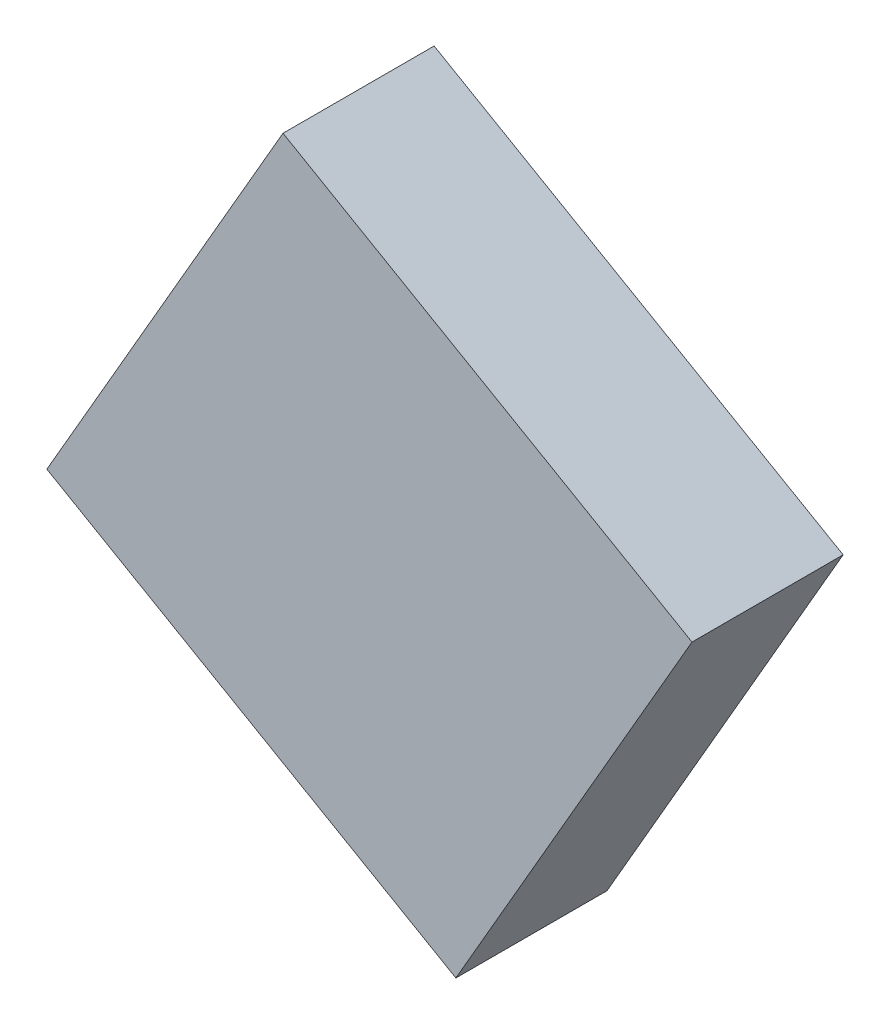
ISO-10303-21;
HEADER;
FILE_DESCRIPTION(('STEP AP214'),'2;1');
FILE_NAME('part.step','',(''),(''),'','','');
FILE_SCHEMA(('AUTOMOTIVE_DESIGN { 1 0 10303 214 1 1 1 1 }'));
ENDSEC;
DATA;
#1=APPLICATION_CONTEXT('core data for automotive mechanical design processes');
#2=APPLICATION_PROTOCOL_DEFINITION('international standard','automotive_design',2000,#1);
#3=PRODUCT_CONTEXT('',#1,'mechanical');
#4=PRODUCT('Part','Part','',(#3));
#5=PRODUCT_RELATED_PRODUCT_CATEGORY('part','',(#4));
#6=PRODUCT_DEFINITION_FORMATION('','',#4);
#7=PRODUCT_DEFINITION_CONTEXT('part definition',#1,'design');
#8=PRODUCT_DEFINITION('design','',#6,#7);
#9=PRODUCT_DEFINITION_SHAPE('','',#8);
#10=(LENGTH_UNIT() NAMED_UNIT(*) SI_UNIT(.MILLI.,.METRE.));
#11=(NAMED_UNIT(*) PLANE_ANGLE_UNIT() SI_UNIT($,.RADIAN.));
#12=(NAMED_UNIT(*) SI_UNIT($,.STERADIAN.) SOLID_ANGLE_UNIT());
#13=UNCERTAINTY_MEASURE_WITH_UNIT(LENGTH_MEASURE(1.E-05),#10,'distance_accuracy_value','');
#14=(GEOMETRIC_REPRESENTATION_CONTEXT(3) GLOBAL_UNCERTAINTY_ASSIGNED_CONTEXT((#13)) GLOBAL_UNIT_ASSIGNED_CONTEXT((#10,
#11,#12)) REPRESENTATION_CONTEXT('',''));
#15=CARTESIAN_POINT('',(0.,0.,0.));
#16=DIRECTION('',(0.,0.,1.));
#17=DIRECTION('',(1.,0.,0.));
#18=AXIS2_PLACEMENT_3D('',#15,#16,#17);
#19=CARTESIAN_POINT('',(-0.91505532,3.41507318,1.59999934));
#20=DIRECTION('',(0.,0.,1.));
#21=DIRECTION('',(1.,0.,0.));
#22=AXIS2_PLACEMENT_3D('',#19,#20,#21);
#23=PLANE('',#22);
#24=DIRECTION('',(0.500002550727971,0.86602393111595,0.));
#25=VECTOR('',#24,1.);
#26=CARTESIAN_POINT('',(3.41507318,0.91505532,1.59999934));
#27=LINE('',#26,#25);
#28=CARTESIAN_POINT('',(3.41507317999968,0.915055319999437,1.59999934));
#29=VERTEX_POINT('',#28);
#30=CARTESIAN_POINT('',(0.915055319999437,-3.41507317999968,1.59999934));
#31=VERTEX_POINT('',#30);
#32=EDGE_CURVE('E53',#29,#31,#27,.F.);
#33=ORIENTED_EDGE('',*,*,#32,.F.);
#34=DIRECTION('',(-0.86602393111595,0.500002550727971,0.));
#35=VECTOR('',#34,1.);
#36=CARTESIAN_POINT('',(-0.91505532,3.41507318,1.59999934));
#37=LINE('',#36,#35);
#38=CARTESIAN_POINT('',(-0.915055319998874,3.41507317999935,1.59999934));
#39=VERTEX_POINT('',#38);
#40=EDGE_CURVE('E68',#39,#29,#37,.F.);
#41=ORIENTED_EDGE('',*,*,#40,.F.);
#42=DIRECTION('',(-0.500002550727971,-0.86602393111595,0.));
#43=VECTOR('',#42,1.);
#44=CARTESIAN_POINT('',(-3.41507318,-0.91505532,1.59999934));
#45=LINE('',#44,#43);
#46=CARTESIAN_POINT('',(-3.41507317999968,-0.915055319999437,1.59999934));
#47=VERTEX_POINT('',#46);
#48=EDGE_CURVE('E20',#47,#39,#45,.F.);
#49=ORIENTED_EDGE('',*,*,#48,.F.);
#50=DIRECTION('',(0.86602393111595,-0.500002550727971,0.));
#51=VECTOR('',#50,1.);
#52=CARTESIAN_POINT('',(0.91505532,-3.41507318,1.59999934));
#53=LINE('',#52,#51);
#54=EDGE_CURVE('E58',#31,#47,#53,.F.);
#55=ORIENTED_EDGE('',*,*,#54,.F.);
#56=EDGE_LOOP('',(#33,#41,#49,#55));
#57=FACE_BOUND('',#56,.T.);
#58=ADVANCED_FACE('F17',(#57),#23,.T.);
#59=CARTESIAN_POINT('',(-3.41507318,-0.91505532,0.));
#60=DIRECTION('',(-0.86602393111595,0.500002550727971,0.));
#61=DIRECTION('',(-0.500002550727971,-0.86602393111595,0.));
#62=AXIS2_PLACEMENT_3D('',#59,#60,#61);
#63=PLANE('',#62);
#64=DIRECTION('',(0.,0.,1.));
#65=VECTOR('',#64,1.);
#66=CARTESIAN_POINT('',(-0.91505532,3.41507318,0.));
#67=LINE('',#66,#65);
#68=CARTESIAN_POINT('',(-0.915055319998874,3.41507317999935,0.));
#69=VERTEX_POINT('',#68);
#70=EDGE_CURVE('E79',#69,#39,#67,.T.);
#71=ORIENTED_EDGE('',*,*,#70,.F.);
#72=DIRECTION('',(-0.500002550727521,-0.86602393111621,0.));
#73=VECTOR('',#72,1.);
#74=CARTESIAN_POINT('',(-0.91505532,3.41507318,0.));
#75=LINE('',#74,#73);
#76=CARTESIAN_POINT('',(-3.41507317999968,-0.915055319999437,0.));
#77=VERTEX_POINT('',#76);
#78=EDGE_CURVE('E74',#69,#77,#75,.T.);
#79=ORIENTED_EDGE('',*,*,#78,.T.);
#80=DIRECTION('',(0.,0.,1.));
#81=VECTOR('',#80,1.);
#82=CARTESIAN_POINT('',(-3.4150731799987,-0.915055319997748,0.));
#83=LINE('',#82,#81);
#84=EDGE_CURVE('E63',#47,#77,#83,.F.);
#85=ORIENTED_EDGE('',*,*,#84,.F.);
#86=ORIENTED_EDGE('',*,*,#48,.T.);
#87=EDGE_LOOP('',(#71,#79,#85,#86));
#88=FACE_BOUND('',#87,.T.);
#89=ADVANCED_FACE('F73',(#88),#63,.T.);
#90=CARTESIAN_POINT('',(0.91505532,-3.41507318,0.));
#91=DIRECTION('',(-0.500002550727971,-0.86602393111595,0.));
#92=DIRECTION('',(0.86602393111595,-0.500002550727971,0.));
#93=AXIS2_PLACEMENT_3D('',#90,#91,#92);
#94=PLANE('',#93);
#95=ORIENTED_EDGE('',*,*,#84,.T.);
#96=DIRECTION('',(0.86602393111621,-0.500002550727521,0.));
#97=VECTOR('',#96,1.);
#98=CARTESIAN_POINT('',(-3.41507318,-0.91505532,0.));
#99=LINE('',#98,#97);
#100=CARTESIAN_POINT('',(0.915055319999437,-3.41507317999968,0.));
#101=VERTEX_POINT('',#100);
#102=EDGE_CURVE('E84',#77,#101,#99,.T.);
#103=ORIENTED_EDGE('',*,*,#102,.T.);
#104=DIRECTION('',(0.,0.,1.));
#105=VECTOR('',#104,1.);
#106=CARTESIAN_POINT('',(0.915055319997748,-3.4150731799987,0.));
#107=LINE('',#106,#105);
#108=EDGE_CURVE('E65',#31,#101,#107,.F.);
#109=ORIENTED_EDGE('',*,*,#108,.F.);
#110=ORIENTED_EDGE('',*,*,#54,.T.);
#111=EDGE_LOOP('',(#95,#103,#109,#110));
#112=FACE_BOUND('',#111,.T.);
#113=ADVANCED_FACE('F60',(#112),#94,.T.);
#114=CARTESIAN_POINT('',(3.41507318,0.91505532,0.));
#115=DIRECTION('',(0.86602393111595,-0.500002550727971,0.));
#116=DIRECTION('',(0.500002550727971,0.86602393111595,0.));
#117=AXIS2_PLACEMENT_3D('',#114,#115,#116);
#118=PLANE('',#117);
#119=ORIENTED_EDGE('',*,*,#108,.T.);
#120=DIRECTION('',(0.500002550727521,0.86602393111621,0.));
#121=VECTOR('',#120,1.);
#122=CARTESIAN_POINT('',(0.91505532,-3.41507318,0.));
#123=LINE('',#122,#121);
#124=CARTESIAN_POINT('',(3.41507317999968,0.915055319999437,0.));
#125=VERTEX_POINT('',#124);
#126=EDGE_CURVE('E26',#101,#125,#123,.T.);
#127=ORIENTED_EDGE('',*,*,#126,.T.);
#128=DIRECTION('',(0.,0.,1.));
#129=VECTOR('',#128,1.);
#130=CARTESIAN_POINT('',(3.4150731799987,0.915055319997748,0.));
#131=LINE('',#130,#129);
#132=EDGE_CURVE('E34',#29,#125,#131,.F.);
#133=ORIENTED_EDGE('',*,*,#132,.F.);
#134=ORIENTED_EDGE('',*,*,#32,.T.);
#135=EDGE_LOOP('',(#119,#127,#133,#134));
#136=FACE_BOUND('',#135,.T.);
#137=ADVANCED_FACE('F88',(#136),#118,.T.);
#138=CARTESIAN_POINT('',(-0.91505532,3.41507318,0.));
#139=DIRECTION('',(0.500002550727971,0.86602393111595,0.));
#140=DIRECTION('',(-0.86602393111595,0.500002550727971,0.));
#141=AXIS2_PLACEMENT_3D('',#138,#139,#140);
#142=PLANE('',#141);
#143=ORIENTED_EDGE('',*,*,#132,.T.);
#144=DIRECTION('',(-0.86602393111621,0.500002550727521,0.));
#145=VECTOR('',#144,1.);
#146=CARTESIAN_POINT('',(3.41507318,0.91505532,0.));
#147=LINE('',#146,#145);
#148=EDGE_CURVE('E11',#125,#69,#147,.T.);
#149=ORIENTED_EDGE('',*,*,#148,.T.);
#150=ORIENTED_EDGE('',*,*,#70,.T.);
#151=ORIENTED_EDGE('',*,*,#40,.T.);
#152=EDGE_LOOP('',(#143,#149,#150,#151));
#153=FACE_BOUND('',#152,.T.);
#154=ADVANCED_FACE('F91',(#153),#142,.T.);
#155=CARTESIAN_POINT('',(-0.91505532,3.41507318,0.));
#156=DIRECTION('',(0.,0.,1.));
#157=DIRECTION('',(1.,0.,0.));
#158=AXIS2_PLACEMENT_3D('',#155,#156,#157);
#159=PLANE('',#158);
#160=ORIENTED_EDGE('',*,*,#126,.F.);
#161=ORIENTED_EDGE('',*,*,#102,.F.);
#162=ORIENTED_EDGE('',*,*,#78,.F.);
#163=ORIENTED_EDGE('',*,*,#148,.F.);
#164=EDGE_LOOP('',(#160,#161,#162,#163));
#165=FACE_BOUND('',#164,.T.);
#166=ADVANCED_FACE('F90',(#165),#159,.F.);
#167=CLOSED_SHELL('',(#58,#89,#113,#137,#154,#166));
#168=MANIFOLD_SOLID_BREP('B1',#167);
#169=ADVANCED_BREP_SHAPE_REPRESENTATION('',(#18,#168),#14);
#170=SHAPE_DEFINITION_REPRESENTATION(#9,#169);
ENDSEC;
END-ISO-10303-21;
